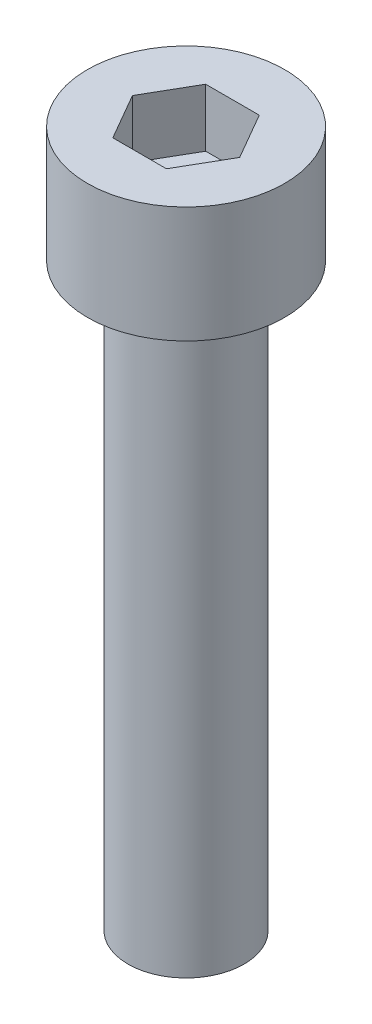
ISO-10303-21;
HEADER;
FILE_DESCRIPTION(('STEP AP214'),'2;1');
FILE_NAME('part.step','',(''),(''),'','','');
FILE_SCHEMA(('AUTOMOTIVE_DESIGN { 1 0 10303 214 1 1 1 1 }'));
ENDSEC;
DATA;
#1=APPLICATION_CONTEXT('core data for automotive mechanical design processes');
#2=APPLICATION_PROTOCOL_DEFINITION('international standard','automotive_design',2000,#1);
#3=PRODUCT_CONTEXT('',#1,'mechanical');
#4=PRODUCT('Part','Part','',(#3));
#5=PRODUCT_RELATED_PRODUCT_CATEGORY('part','',(#4));
#6=PRODUCT_DEFINITION_FORMATION('','',#4);
#7=PRODUCT_DEFINITION_CONTEXT('part definition',#1,'design');
#8=PRODUCT_DEFINITION('design','',#6,#7);
#9=PRODUCT_DEFINITION_SHAPE('','',#8);
#10=(LENGTH_UNIT() NAMED_UNIT(*) SI_UNIT(.MILLI.,.METRE.));
#11=(NAMED_UNIT(*) PLANE_ANGLE_UNIT() SI_UNIT($,.RADIAN.));
#12=(NAMED_UNIT(*) SI_UNIT($,.STERADIAN.) SOLID_ANGLE_UNIT());
#13=UNCERTAINTY_MEASURE_WITH_UNIT(LENGTH_MEASURE(1.E-05),#10,'distance_accuracy_value','');
#14=(GEOMETRIC_REPRESENTATION_CONTEXT(3) GLOBAL_UNCERTAINTY_ASSIGNED_CONTEXT((#13)) GLOBAL_UNIT_ASSIGNED_CONTEXT((#10,
#11,#12)) REPRESENTATION_CONTEXT('',''));
#15=CARTESIAN_POINT('',(0.,0.,0.));
#16=DIRECTION('',(0.,0.,1.));
#17=DIRECTION('',(1.,0.,0.));
#18=AXIS2_PLACEMENT_3D('',#15,#16,#17);
#19=CARTESIAN_POINT('',(0.,0.,0.));
#20=DIRECTION('',(0.,1.,0.));
#21=DIRECTION('',(0.,0.,1.));
#22=AXIS2_PLACEMENT_3D('',#19,#20,#21);
#23=PLANE('',#22);
#24=CARTESIAN_POINT('',(0.,0.,0.));
#25=DIRECTION('',(0.,1.,0.));
#26=DIRECTION('',(0.,0.,1.));
#27=AXIS2_PLACEMENT_3D('',#24,#25,#26);
#28=CIRCLE('',#27,2.5);
#29=CARTESIAN_POINT('',(0.,0.,2.5));
#30=VERTEX_POINT('',#29);
#31=EDGE_CURVE('E11',#30,#30,#28,.T.);
#32=ORIENTED_EDGE('',*,*,#31,.F.);
#33=EDGE_LOOP('',(#32));
#34=FACE_BOUND('',#33,.T.);
#35=ADVANCED_FACE('F35',(#34),#23,.F.);
#36=CARTESIAN_POINT('',(0.,30.,0.));
#37=DIRECTION('',(0.,1.,0.));
#38=DIRECTION('',(0.,0.,1.));
#39=AXIS2_PLACEMENT_3D('',#36,#37,#38);
#40=CYLINDRICAL_SURFACE('',#39,2.5);
#41=CARTESIAN_POINT('',(0.,25.,0.));
#42=DIRECTION('',(0.,1.,0.));
#43=DIRECTION('',(0.,0.,1.));
#44=AXIS2_PLACEMENT_3D('',#41,#42,#43);
#45=CIRCLE('',#44,2.5);
#46=CARTESIAN_POINT('',(0.,25.,2.5));
#47=VERTEX_POINT('',#46);
#48=EDGE_CURVE('E42',#47,#47,#45,.T.);
#49=ORIENTED_EDGE('',*,*,#48,.F.);
#50=EDGE_LOOP('',(#49));
#51=FACE_BOUND('',#50,.T.);
#52=ORIENTED_EDGE('',*,*,#31,.T.);
#53=EDGE_LOOP('',(#52));
#54=FACE_BOUND('',#53,.T.);
#55=ADVANCED_FACE('F151',(#51,#54),#40,.T.);
#56=CARTESIAN_POINT('',(2.5,25.,0.));
#57=DIRECTION('',(0.,1.,0.));
#58=DIRECTION('',(0.,0.,1.));
#59=AXIS2_PLACEMENT_3D('',#56,#57,#58);
#60=PLANE('',#59);
#61=CARTESIAN_POINT('',(0.,25.,0.));
#62=DIRECTION('',(0.,1.,0.));
#63=DIRECTION('',(0.,0.,1.));
#64=AXIS2_PLACEMENT_3D('',#61,#62,#63);
#65=CIRCLE('',#64,4.25);
#66=CARTESIAN_POINT('',(0.,25.,4.25));
#67=VERTEX_POINT('',#66);
#68=EDGE_CURVE('E144',#67,#67,#65,.T.);
#69=ORIENTED_EDGE('',*,*,#68,.F.);
#70=EDGE_LOOP('',(#69));
#71=FACE_BOUND('',#70,.T.);
#72=ORIENTED_EDGE('',*,*,#48,.T.);
#73=EDGE_LOOP('',(#72));
#74=FACE_BOUND('',#73,.T.);
#75=ADVANCED_FACE('F149',(#71,#74),#60,.F.);
#76=CARTESIAN_POINT('',(0.,30.,0.));
#77=DIRECTION('',(0.,1.,0.));
#78=DIRECTION('',(0.,0.,1.));
#79=AXIS2_PLACEMENT_3D('',#76,#77,#78);
#80=CYLINDRICAL_SURFACE('',#79,4.25);
#81=CARTESIAN_POINT('',(0.,30.,0.));
#82=DIRECTION('',(0.,1.,0.));
#83=DIRECTION('',(0.,0.,1.));
#84=AXIS2_PLACEMENT_3D('',#81,#82,#83);
#85=CIRCLE('',#84,4.25);
#86=CARTESIAN_POINT('',(0.,30.,4.25));
#87=VERTEX_POINT('',#86);
#88=EDGE_CURVE('E136',#87,#87,#85,.T.);
#89=ORIENTED_EDGE('',*,*,#88,.F.);
#90=EDGE_LOOP('',(#89));
#91=FACE_BOUND('',#90,.T.);
#92=ORIENTED_EDGE('',*,*,#68,.T.);
#93=EDGE_LOOP('',(#92));
#94=FACE_BOUND('',#93,.T.);
#95=ADVANCED_FACE('F169',(#91,#94),#80,.T.);
#96=CARTESIAN_POINT('',(4.25,30.,0.));
#97=DIRECTION('',(0.,-1.,0.));
#98=DIRECTION('',(0.,0.,-1.));
#99=AXIS2_PLACEMENT_3D('',#96,#97,#98);
#100=PLANE('',#99);
#101=DIRECTION('',(-1.,0.,0.));
#102=VECTOR('',#101,1.);
#103=CARTESIAN_POINT('',(1.15470053837925,30.,-2.));
#104=LINE('',#103,#102);
#105=CARTESIAN_POINT('',(1.15470053837925,30.,-2.));
#106=VERTEX_POINT('',#105);
#107=CARTESIAN_POINT('',(-1.15470053837925,30.,-2.));
#108=VERTEX_POINT('',#107);
#109=EDGE_CURVE('E123',#106,#108,#104,.T.);
#110=ORIENTED_EDGE('',*,*,#109,.F.);
#111=DIRECTION('',(-0.5,0.,-0.866025403784438));
#112=VECTOR('',#111,1.);
#113=CARTESIAN_POINT('',(2.3094010767585,30.,0.));
#114=LINE('',#113,#112);
#115=CARTESIAN_POINT('',(2.3094010767585,30.,0.));
#116=VERTEX_POINT('',#115);
#117=EDGE_CURVE('E49',#116,#106,#114,.T.);
#118=ORIENTED_EDGE('',*,*,#117,.F.);
#119=DIRECTION('',(0.5,0.,-0.866025403784439));
#120=VECTOR('',#119,1.);
#121=CARTESIAN_POINT('',(1.15470053837925,30.,2.));
#122=LINE('',#121,#120);
#123=CARTESIAN_POINT('',(1.15470053837925,30.,2.));
#124=VERTEX_POINT('',#123);
#125=EDGE_CURVE('E132',#124,#116,#122,.T.);
#126=ORIENTED_EDGE('',*,*,#125,.F.);
#127=DIRECTION('',(1.,0.,0.));
#128=VECTOR('',#127,1.);
#129=CARTESIAN_POINT('',(-1.15470053837925,30.,2.));
#130=LINE('',#129,#128);
#131=CARTESIAN_POINT('',(-1.15470053837925,30.,2.));
#132=VERTEX_POINT('',#131);
#133=EDGE_CURVE('E130',#132,#124,#130,.T.);
#134=ORIENTED_EDGE('',*,*,#133,.F.);
#135=DIRECTION('',(0.5,0.,0.866025403784439));
#136=VECTOR('',#135,1.);
#137=CARTESIAN_POINT('',(-2.3094010767585,30.,0.));
#138=LINE('',#137,#136);
#139=CARTESIAN_POINT('',(-2.3094010767585,30.,0.));
#140=VERTEX_POINT('',#139);
#141=EDGE_CURVE('E97',#140,#132,#138,.T.);
#142=ORIENTED_EDGE('',*,*,#141,.F.);
#143=DIRECTION('',(-0.5,0.,0.866025403784438));
#144=VECTOR('',#143,1.);
#145=CARTESIAN_POINT('',(-1.15470053837925,30.,-2.));
#146=LINE('',#145,#144);
#147=EDGE_CURVE('E126',#108,#140,#146,.T.);
#148=ORIENTED_EDGE('',*,*,#147,.F.);
#149=EDGE_LOOP('',(#110,#118,#126,#134,#142,#148));
#150=FACE_BOUND('',#149,.T.);
#151=ORIENTED_EDGE('',*,*,#88,.T.);
#152=EDGE_LOOP('',(#151));
#153=FACE_BOUND('',#152,.T.);
#154=ADVANCED_FACE('F177',(#150,#153),#100,.F.);
#155=CARTESIAN_POINT('',(2.3094010767585,27.5,0.));
#156=DIRECTION('',(0.866025403784438,0.,-0.5));
#157=DIRECTION('',(-0.5,0.,-0.866025403784438));
#158=AXIS2_PLACEMENT_3D('',#155,#156,#157);
#159=PLANE('',#158);
#160=ORIENTED_EDGE('',*,*,#117,.T.);
#161=DIRECTION('',(0.,1.,0.));
#162=VECTOR('',#161,1.);
#163=CARTESIAN_POINT('',(1.15470053837925,27.5,-2.));
#164=LINE('',#163,#162);
#165=CARTESIAN_POINT('',(1.15470053837925,27.5,-2.));
#166=VERTEX_POINT('',#165);
#167=EDGE_CURVE('E79',#166,#106,#164,.T.);
#168=ORIENTED_EDGE('',*,*,#167,.F.);
#169=DIRECTION('',(-0.5,0.,-0.866025403784438));
#170=VECTOR('',#169,1.);
#171=CARTESIAN_POINT('',(2.3094010767585,27.5,0.));
#172=LINE('',#171,#170);
#173=CARTESIAN_POINT('',(2.3094010767585,27.5,0.));
#174=VERTEX_POINT('',#173);
#175=EDGE_CURVE('E134',#174,#166,#172,.T.);
#176=ORIENTED_EDGE('',*,*,#175,.F.);
#177=DIRECTION('',(0.,1.,0.));
#178=VECTOR('',#177,1.);
#179=CARTESIAN_POINT('',(2.3094010767585,27.5,0.));
#180=LINE('',#179,#178);
#181=EDGE_CURVE('E57',#174,#116,#180,.T.);
#182=ORIENTED_EDGE('',*,*,#181,.T.);
#183=EDGE_LOOP('',(#160,#168,#176,#182));
#184=FACE_BOUND('',#183,.T.);
#185=ADVANCED_FACE('F185',(#184),#159,.F.);
#186=CARTESIAN_POINT('',(1.15470053837925,27.5,2.));
#187=DIRECTION('',(0.866025403784439,0.,0.5));
#188=DIRECTION('',(0.5,0.,-0.866025403784439));
#189=AXIS2_PLACEMENT_3D('',#186,#187,#188);
#190=PLANE('',#189);
#191=ORIENTED_EDGE('',*,*,#125,.T.);
#192=ORIENTED_EDGE('',*,*,#181,.F.);
#193=DIRECTION('',(0.5,0.,-0.866025403784439));
#194=VECTOR('',#193,1.);
#195=CARTESIAN_POINT('',(1.15470053837925,27.5,2.));
#196=LINE('',#195,#194);
#197=CARTESIAN_POINT('',(1.15470053837925,27.5,2.));
#198=VERTEX_POINT('',#197);
#199=EDGE_CURVE('E109',#198,#174,#196,.T.);
#200=ORIENTED_EDGE('',*,*,#199,.F.);
#201=DIRECTION('',(0.,1.,0.));
#202=VECTOR('',#201,1.);
#203=CARTESIAN_POINT('',(1.15470053837925,27.5,2.));
#204=LINE('',#203,#202);
#205=EDGE_CURVE('E101',#198,#124,#204,.T.);
#206=ORIENTED_EDGE('',*,*,#205,.T.);
#207=EDGE_LOOP('',(#191,#192,#200,#206));
#208=FACE_BOUND('',#207,.T.);
#209=ADVANCED_FACE('F193',(#208),#190,.F.);
#210=CARTESIAN_POINT('',(-1.15470053837925,27.5,2.));
#211=DIRECTION('',(0.,0.,1.));
#212=DIRECTION('',(1.,0.,0.));
#213=AXIS2_PLACEMENT_3D('',#210,#211,#212);
#214=PLANE('',#213);
#215=ORIENTED_EDGE('',*,*,#133,.T.);
#216=ORIENTED_EDGE('',*,*,#205,.F.);
#217=DIRECTION('',(1.,0.,0.));
#218=VECTOR('',#217,1.);
#219=CARTESIAN_POINT('',(-1.15470053837925,27.5,2.));
#220=LINE('',#219,#218);
#221=CARTESIAN_POINT('',(-1.15470053837925,27.5,2.));
#222=VERTEX_POINT('',#221);
#223=EDGE_CURVE('E105',#222,#198,#220,.T.);
#224=ORIENTED_EDGE('',*,*,#223,.F.);
#225=DIRECTION('',(0.,1.,0.));
#226=VECTOR('',#225,1.);
#227=CARTESIAN_POINT('',(-1.15470053837925,27.5,2.));
#228=LINE('',#227,#226);
#229=EDGE_CURVE('E90',#222,#132,#228,.T.);
#230=ORIENTED_EDGE('',*,*,#229,.T.);
#231=EDGE_LOOP('',(#215,#216,#224,#230));
#232=FACE_BOUND('',#231,.T.);
#233=ADVANCED_FACE('F106',(#232),#214,.F.);
#234=CARTESIAN_POINT('',(-2.3094010767585,27.5,0.));
#235=DIRECTION('',(-0.866025403784438,0.,0.5));
#236=DIRECTION('',(0.5,0.,0.866025403784439));
#237=AXIS2_PLACEMENT_3D('',#234,#235,#236);
#238=PLANE('',#237);
#239=ORIENTED_EDGE('',*,*,#141,.T.);
#240=ORIENTED_EDGE('',*,*,#229,.F.);
#241=DIRECTION('',(0.5,0.,0.866025403784439));
#242=VECTOR('',#241,1.);
#243=CARTESIAN_POINT('',(-2.3094010767585,27.5,0.));
#244=LINE('',#243,#242);
#245=CARTESIAN_POINT('',(-2.3094010767585,27.5,0.));
#246=VERTEX_POINT('',#245);
#247=EDGE_CURVE('E94',#246,#222,#244,.T.);
#248=ORIENTED_EDGE('',*,*,#247,.F.);
#249=DIRECTION('',(0.,1.,0.));
#250=VECTOR('',#249,1.);
#251=CARTESIAN_POINT('',(-2.3094010767585,27.5,0.));
#252=LINE('',#251,#250);
#253=EDGE_CURVE('E102',#246,#140,#252,.T.);
#254=ORIENTED_EDGE('',*,*,#253,.T.);
#255=EDGE_LOOP('',(#239,#240,#248,#254));
#256=FACE_BOUND('',#255,.T.);
#257=ADVANCED_FACE('F92',(#256),#238,.F.);
#258=CARTESIAN_POINT('',(-1.15470053837925,27.5,-2.));
#259=DIRECTION('',(-0.866025403784439,0.,-0.5));
#260=DIRECTION('',(-0.5,0.,0.866025403784439));
#261=AXIS2_PLACEMENT_3D('',#258,#259,#260);
#262=PLANE('',#261);
#263=ORIENTED_EDGE('',*,*,#147,.T.);
#264=ORIENTED_EDGE('',*,*,#253,.F.);
#265=DIRECTION('',(-0.5,0.,0.866025403784438));
#266=VECTOR('',#265,1.);
#267=CARTESIAN_POINT('',(-1.15470053837925,27.5,-2.));
#268=LINE('',#267,#266);
#269=CARTESIAN_POINT('',(-1.15470053837925,27.5,-2.));
#270=VERTEX_POINT('',#269);
#271=EDGE_CURVE('E115',#270,#246,#268,.T.);
#272=ORIENTED_EDGE('',*,*,#271,.F.);
#273=DIRECTION('',(0.,1.,0.));
#274=VECTOR('',#273,1.);
#275=CARTESIAN_POINT('',(-1.15470053837925,27.5,-2.));
#276=LINE('',#275,#274);
#277=EDGE_CURVE('E139',#270,#108,#276,.T.);
#278=ORIENTED_EDGE('',*,*,#277,.T.);
#279=EDGE_LOOP('',(#263,#264,#272,#278));
#280=FACE_BOUND('',#279,.T.);
#281=ADVANCED_FACE('F212',(#280),#262,.F.);
#282=CARTESIAN_POINT('',(1.15470053837925,27.5,-2.));
#283=DIRECTION('',(0.,0.,-1.));
#284=DIRECTION('',(-1.,0.,0.));
#285=AXIS2_PLACEMENT_3D('',#282,#283,#284);
#286=PLANE('',#285);
#287=ORIENTED_EDGE('',*,*,#109,.T.);
#288=ORIENTED_EDGE('',*,*,#277,.F.);
#289=DIRECTION('',(-1.,0.,0.));
#290=VECTOR('',#289,1.);
#291=CARTESIAN_POINT('',(1.15470053837925,27.5,-2.));
#292=LINE('',#291,#290);
#293=EDGE_CURVE('E117',#166,#270,#292,.T.);
#294=ORIENTED_EDGE('',*,*,#293,.F.);
#295=ORIENTED_EDGE('',*,*,#167,.T.);
#296=EDGE_LOOP('',(#287,#288,#294,#295));
#297=FACE_BOUND('',#296,.T.);
#298=ADVANCED_FACE('F219',(#297),#286,.F.);
#299=CARTESIAN_POINT('',(0.,27.5,0.));
#300=DIRECTION('',(0.,1.,0.));
#301=DIRECTION('',(0.,0.,1.));
#302=AXIS2_PLACEMENT_3D('',#299,#300,#301);
#303=PLANE('',#302);
#304=ORIENTED_EDGE('',*,*,#175,.T.);
#305=ORIENTED_EDGE('',*,*,#293,.T.);
#306=ORIENTED_EDGE('',*,*,#271,.T.);
#307=ORIENTED_EDGE('',*,*,#247,.T.);
#308=ORIENTED_EDGE('',*,*,#223,.T.);
#309=ORIENTED_EDGE('',*,*,#199,.T.);
#310=EDGE_LOOP('',(#304,#305,#306,#307,#308,#309));
#311=FACE_BOUND('',#310,.T.);
#312=ADVANCED_FACE('F112',(#311),#303,.T.);
#313=CLOSED_SHELL('',(#35,#55,#75,#95,#154,#185,#209,#233,#257,#281,#298,#312));
#314=MANIFOLD_SOLID_BREP('B2',#313);
#315=ADVANCED_BREP_SHAPE_REPRESENTATION('',(#18,#314),#14);
#316=SHAPE_DEFINITION_REPRESENTATION(#9,#315);
ENDSEC;
END-ISO-10303-21;
